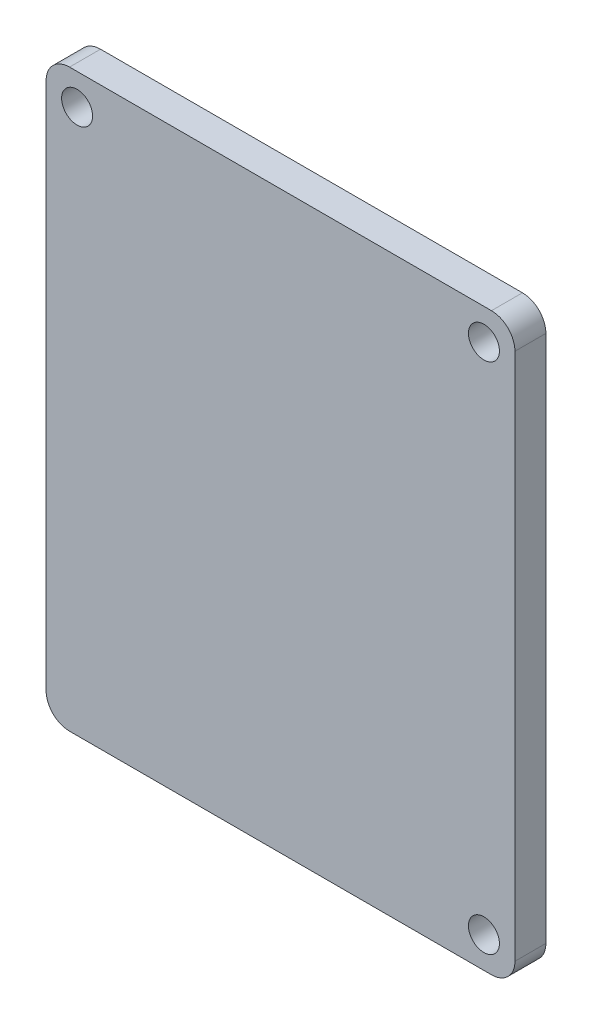
ISO-10303-21;
HEADER;
FILE_DESCRIPTION(('STEP AP214'),'2;1');
FILE_NAME('part.step','',(''),(''),'','','');
FILE_SCHEMA(('AUTOMOTIVE_DESIGN { 1 0 10303 214 1 1 1 1 }'));
ENDSEC;
DATA;
#1=APPLICATION_CONTEXT('core data for automotive mechanical design processes');
#2=APPLICATION_PROTOCOL_DEFINITION('international standard','automotive_design',2000,#1);
#3=PRODUCT_CONTEXT('',#1,'mechanical');
#4=PRODUCT('Part','Part','',(#3));
#5=PRODUCT_RELATED_PRODUCT_CATEGORY('part','',(#4));
#6=PRODUCT_DEFINITION_FORMATION('','',#4);
#7=PRODUCT_DEFINITION_CONTEXT('part definition',#1,'design');
#8=PRODUCT_DEFINITION('design','',#6,#7);
#9=PRODUCT_DEFINITION_SHAPE('','',#8);
#10=(LENGTH_UNIT() NAMED_UNIT(*) SI_UNIT(.MILLI.,.METRE.));
#11=(NAMED_UNIT(*) PLANE_ANGLE_UNIT() SI_UNIT($,.RADIAN.));
#12=(NAMED_UNIT(*) SI_UNIT($,.STERADIAN.) SOLID_ANGLE_UNIT());
#13=UNCERTAINTY_MEASURE_WITH_UNIT(LENGTH_MEASURE(1.E-05),#10,'distance_accuracy_value','');
#14=(GEOMETRIC_REPRESENTATION_CONTEXT(3) GLOBAL_UNCERTAINTY_ASSIGNED_CONTEXT((#13)) GLOBAL_UNIT_ASSIGNED_CONTEXT((#10,
#11,#12)) REPRESENTATION_CONTEXT('',''));
#15=CARTESIAN_POINT('',(0.,0.,0.));
#16=DIRECTION('',(0.,0.,1.));
#17=DIRECTION('',(1.,0.,0.));
#18=AXIS2_PLACEMENT_3D('',#15,#16,#17);
#19=CARTESIAN_POINT('',(2.2696921364756,53.4303078635244,3.));
#20=DIRECTION('',(0.,0.,1.));
#21=DIRECTION('',(1.,0.,0.));
#22=AXIS2_PLACEMENT_3D('',#19,#20,#21);
#23=PLANE('',#22);
#24=CARTESIAN_POINT('',(42.4,52.7,3.));
#25=DIRECTION('',(0.,0.,1.));
#26=DIRECTION('',(1.,0.,0.));
#27=AXIS2_PLACEMENT_3D('',#24,#25,#26);
#28=CIRCLE('',#27,1.5);
#29=CARTESIAN_POINT('',(43.9,52.7,3.));
#30=VERTEX_POINT('',#29);
#31=EDGE_CURVE('E188',#30,#30,#28,.T.);
#32=ORIENTED_EDGE('',*,*,#31,.F.);
#33=EDGE_LOOP('',(#32));
#34=FACE_BOUND('',#33,.T.);
#35=CARTESIAN_POINT('',(2.2696921364756,53.4303078635244,3.));
#36=DIRECTION('',(0.,0.,1.));
#37=DIRECTION('',(1.,0.,0.));
#38=AXIS2_PLACEMENT_3D('',#35,#36,#37);
#39=CIRCLE('',#38,2.26969213647562);
#40=CARTESIAN_POINT('',(2.26969213647562,55.7,3.));
#41=VERTEX_POINT('',#40);
#42=CARTESIAN_POINT('',(0.,53.4303078635244,3.));
#43=VERTEX_POINT('',#42);
#44=EDGE_CURVE('E151',#41,#43,#39,.T.);
#45=ORIENTED_EDGE('',*,*,#44,.T.);
#46=DIRECTION('',(0.,-1.,0.));
#47=VECTOR('',#46,1.);
#48=CARTESIAN_POINT('',(0.,2.26969213647563,3.));
#49=LINE('',#48,#47);
#50=CARTESIAN_POINT('',(0.,2.26969213647562,3.));
#51=VERTEX_POINT('',#50);
#52=EDGE_CURVE('E99',#43,#51,#49,.T.);
#53=ORIENTED_EDGE('',*,*,#52,.T.);
#54=CARTESIAN_POINT('',(2.26969213647562,2.26969213647562,3.));
#55=DIRECTION('',(0.,0.,1.));
#56=DIRECTION('',(-1.,0.,0.));
#57=AXIS2_PLACEMENT_3D('',#54,#55,#56);
#58=CIRCLE('',#57,2.26969213647562);
#59=CARTESIAN_POINT('',(2.26969213647563,0.,3.));
#60=VERTEX_POINT('',#59);
#61=EDGE_CURVE('E166',#51,#60,#58,.T.);
#62=ORIENTED_EDGE('',*,*,#61,.T.);
#63=DIRECTION('',(1.,0.,0.));
#64=VECTOR('',#63,1.);
#65=CARTESIAN_POINT('',(2.26969213647563,0.,3.));
#66=LINE('',#65,#64);
#67=CARTESIAN_POINT('',(43.1303078635244,0.,3.));
#68=VERTEX_POINT('',#67);
#69=EDGE_CURVE('E179',#60,#68,#66,.T.);
#70=ORIENTED_EDGE('',*,*,#69,.T.);
#71=CARTESIAN_POINT('',(43.1303078635244,2.26969213647562,3.));
#72=DIRECTION('',(0.,0.,1.));
#73=DIRECTION('',(1.,0.,0.));
#74=AXIS2_PLACEMENT_3D('',#71,#72,#73);
#75=CIRCLE('',#74,2.26969213647562);
#76=CARTESIAN_POINT('',(45.4,2.26969213647563,3.));
#77=VERTEX_POINT('',#76);
#78=EDGE_CURVE('E118',#68,#77,#75,.T.);
#79=ORIENTED_EDGE('',*,*,#78,.T.);
#80=DIRECTION('',(0.,1.,0.));
#81=VECTOR('',#80,1.);
#82=CARTESIAN_POINT('',(45.4,2.26969213647563,3.));
#83=LINE('',#82,#81);
#84=CARTESIAN_POINT('',(45.4,53.4303078635244,3.));
#85=VERTEX_POINT('',#84);
#86=EDGE_CURVE('E112',#77,#85,#83,.T.);
#87=ORIENTED_EDGE('',*,*,#86,.T.);
#88=CARTESIAN_POINT('',(43.1303078635244,53.4303078635244,3.));
#89=DIRECTION('',(0.,0.,1.));
#90=DIRECTION('',(1.,0.,0.));
#91=AXIS2_PLACEMENT_3D('',#88,#89,#90);
#92=CIRCLE('',#91,2.26969213647562);
#93=CARTESIAN_POINT('',(43.1303078635244,55.7,3.));
#94=VERTEX_POINT('',#93);
#95=EDGE_CURVE('E116',#85,#94,#92,.T.);
#96=ORIENTED_EDGE('',*,*,#95,.T.);
#97=DIRECTION('',(-1.,0.,0.));
#98=VECTOR('',#97,1.);
#99=CARTESIAN_POINT('',(2.26969213647562,55.7,3.));
#100=LINE('',#99,#98);
#101=EDGE_CURVE('E56',#94,#41,#100,.T.);
#102=ORIENTED_EDGE('',*,*,#101,.T.);
#103=EDGE_LOOP('',(#45,#53,#62,#70,#79,#87,#96,#102));
#104=FACE_BOUND('',#103,.T.);
#105=CARTESIAN_POINT('',(42.4,3.,3.));
#106=DIRECTION('',(0.,0.,1.));
#107=DIRECTION('',(1.,0.,0.));
#108=AXIS2_PLACEMENT_3D('',#105,#106,#107);
#109=CIRCLE('',#108,1.5);
#110=CARTESIAN_POINT('',(43.9,3.,3.));
#111=VERTEX_POINT('',#110);
#112=EDGE_CURVE('E140',#111,#111,#109,.T.);
#113=ORIENTED_EDGE('',*,*,#112,.F.);
#114=EDGE_LOOP('',(#113));
#115=FACE_BOUND('',#114,.T.);
#116=CARTESIAN_POINT('',(3.,52.7,3.));
#117=DIRECTION('',(0.,0.,1.));
#118=DIRECTION('',(1.,0.,0.));
#119=AXIS2_PLACEMENT_3D('',#116,#117,#118);
#120=CIRCLE('',#119,1.5);
#121=CARTESIAN_POINT('',(4.5,52.7,3.));
#122=VERTEX_POINT('',#121);
#123=EDGE_CURVE('E194',#122,#122,#120,.T.);
#124=ORIENTED_EDGE('',*,*,#123,.F.);
#125=EDGE_LOOP('',(#124));
#126=FACE_BOUND('',#125,.T.);
#127=ADVANCED_FACE('F39',(#34,#104,#115,#126),#23,.T.);
#128=CARTESIAN_POINT('',(2.2696921364756,53.4303078635244,0.));
#129=DIRECTION('',(0.,0.,1.));
#130=DIRECTION('',(1.,0.,0.));
#131=AXIS2_PLACEMENT_3D('',#128,#129,#130);
#132=PLANE('',#131);
#133=CARTESIAN_POINT('',(2.2696921364756,53.4303078635244,0.));
#134=DIRECTION('',(0.,0.,1.));
#135=DIRECTION('',(1.,0.,0.));
#136=AXIS2_PLACEMENT_3D('',#133,#134,#135);
#137=CIRCLE('',#136,2.26969213647562);
#138=CARTESIAN_POINT('',(2.26969213647562,55.7,0.));
#139=VERTEX_POINT('',#138);
#140=CARTESIAN_POINT('',(0.,53.4303078635244,0.));
#141=VERTEX_POINT('',#140);
#142=EDGE_CURVE('E136',#139,#141,#137,.T.);
#143=ORIENTED_EDGE('',*,*,#142,.F.);
#144=DIRECTION('',(-1.,0.,0.));
#145=VECTOR('',#144,1.);
#146=CARTESIAN_POINT('',(2.26969213647562,55.7,0.));
#147=LINE('',#146,#145);
#148=CARTESIAN_POINT('',(43.1303078635244,55.7,0.));
#149=VERTEX_POINT('',#148);
#150=EDGE_CURVE('E91',#149,#139,#147,.T.);
#151=ORIENTED_EDGE('',*,*,#150,.F.);
#152=CARTESIAN_POINT('',(43.1303078635244,53.4303078635244,0.));
#153=DIRECTION('',(0.,0.,1.));
#154=DIRECTION('',(1.,0.,0.));
#155=AXIS2_PLACEMENT_3D('',#152,#153,#154);
#156=CIRCLE('',#155,2.26969213647562);
#157=CARTESIAN_POINT('',(45.4,53.4303078635244,0.));
#158=VERTEX_POINT('',#157);
#159=EDGE_CURVE('E85',#158,#149,#156,.T.);
#160=ORIENTED_EDGE('',*,*,#159,.F.);
#161=DIRECTION('',(0.,1.,0.));
#162=VECTOR('',#161,1.);
#163=CARTESIAN_POINT('',(45.4,2.26969213647563,0.));
#164=LINE('',#163,#162);
#165=CARTESIAN_POINT('',(45.4,2.26969213647563,0.));
#166=VERTEX_POINT('',#165);
#167=EDGE_CURVE('E126',#166,#158,#164,.T.);
#168=ORIENTED_EDGE('',*,*,#167,.F.);
#169=CARTESIAN_POINT('',(43.1303078635244,2.26969213647562,0.));
#170=DIRECTION('',(0.,0.,1.));
#171=DIRECTION('',(1.,0.,0.));
#172=AXIS2_PLACEMENT_3D('',#169,#170,#171);
#173=CIRCLE('',#172,2.26969213647562);
#174=CARTESIAN_POINT('',(43.1303078635244,0.,0.));
#175=VERTEX_POINT('',#174);
#176=EDGE_CURVE('E146',#175,#166,#173,.T.);
#177=ORIENTED_EDGE('',*,*,#176,.F.);
#178=DIRECTION('',(1.,0.,0.));
#179=VECTOR('',#178,1.);
#180=CARTESIAN_POINT('',(2.26969213647563,0.,0.));
#181=LINE('',#180,#179);
#182=CARTESIAN_POINT('',(2.26969213647563,0.,0.));
#183=VERTEX_POINT('',#182);
#184=EDGE_CURVE('E144',#183,#175,#181,.T.);
#185=ORIENTED_EDGE('',*,*,#184,.F.);
#186=CARTESIAN_POINT('',(2.26969213647562,2.26969213647562,0.));
#187=DIRECTION('',(0.,0.,1.));
#188=DIRECTION('',(-1.,0.,0.));
#189=AXIS2_PLACEMENT_3D('',#186,#187,#188);
#190=CIRCLE('',#189,2.26969213647562);
#191=CARTESIAN_POINT('',(0.,2.26969213647562,0.));
#192=VERTEX_POINT('',#191);
#193=EDGE_CURVE('E142',#192,#183,#190,.T.);
#194=ORIENTED_EDGE('',*,*,#193,.F.);
#195=DIRECTION('',(0.,-1.,0.));
#196=VECTOR('',#195,1.);
#197=CARTESIAN_POINT('',(0.,2.26969213647563,0.));
#198=LINE('',#197,#196);
#199=EDGE_CURVE('E139',#141,#192,#198,.T.);
#200=ORIENTED_EDGE('',*,*,#199,.F.);
#201=EDGE_LOOP('',(#143,#151,#160,#168,#177,#185,#194,#200));
#202=FACE_BOUND('',#201,.T.);
#203=CARTESIAN_POINT('',(42.4,3.,0.));
#204=DIRECTION('',(0.,0.,1.));
#205=DIRECTION('',(1.,0.,0.));
#206=AXIS2_PLACEMENT_3D('',#203,#204,#205);
#207=CIRCLE('',#206,1.5);
#208=CARTESIAN_POINT('',(43.9,3.,0.));
#209=VERTEX_POINT('',#208);
#210=EDGE_CURVE('E185',#209,#209,#207,.T.);
#211=ORIENTED_EDGE('',*,*,#210,.T.);
#212=EDGE_LOOP('',(#211));
#213=FACE_BOUND('',#212,.T.);
#214=CARTESIAN_POINT('',(42.4,52.7,0.));
#215=DIRECTION('',(0.,0.,1.));
#216=DIRECTION('',(1.,0.,0.));
#217=AXIS2_PLACEMENT_3D('',#214,#215,#216);
#218=CIRCLE('',#217,1.5);
#219=CARTESIAN_POINT('',(43.9,52.7,0.));
#220=VERTEX_POINT('',#219);
#221=EDGE_CURVE('E191',#220,#220,#218,.T.);
#222=ORIENTED_EDGE('',*,*,#221,.T.);
#223=EDGE_LOOP('',(#222));
#224=FACE_BOUND('',#223,.T.);
#225=CARTESIAN_POINT('',(3.,52.7,0.));
#226=DIRECTION('',(0.,0.,1.));
#227=DIRECTION('',(1.,0.,0.));
#228=AXIS2_PLACEMENT_3D('',#225,#226,#227);
#229=CIRCLE('',#228,1.5);
#230=CARTESIAN_POINT('',(4.5,52.7,0.));
#231=VERTEX_POINT('',#230);
#232=EDGE_CURVE('E197',#231,#231,#229,.T.);
#233=ORIENTED_EDGE('',*,*,#232,.T.);
#234=EDGE_LOOP('',(#233));
#235=FACE_BOUND('',#234,.T.);
#236=ADVANCED_FACE('F170',(#202,#213,#224,#235),#132,.F.);
#237=CARTESIAN_POINT('',(2.2696921364756,53.4303078635244,3.));
#238=DIRECTION('',(0.,0.,-1.));
#239=DIRECTION('',(-1.,0.,0.));
#240=AXIS2_PLACEMENT_3D('',#237,#238,#239);
#241=CYLINDRICAL_SURFACE('',#240,2.26969213647562);
#242=ORIENTED_EDGE('',*,*,#142,.T.);
#243=DIRECTION('',(0.,0.,-1.));
#244=VECTOR('',#243,1.);
#245=CARTESIAN_POINT('',(0.,53.4303078635244,3.));
#246=LINE('',#245,#244);
#247=EDGE_CURVE('E11',#43,#141,#246,.T.);
#248=ORIENTED_EDGE('',*,*,#247,.F.);
#249=ORIENTED_EDGE('',*,*,#44,.F.);
#250=DIRECTION('',(0.,0.,-1.));
#251=VECTOR('',#250,1.);
#252=CARTESIAN_POINT('',(2.26969213647562,55.7,3.));
#253=LINE('',#252,#251);
#254=EDGE_CURVE('E132',#41,#139,#253,.T.);
#255=ORIENTED_EDGE('',*,*,#254,.T.);
#256=EDGE_LOOP('',(#242,#248,#249,#255));
#257=FACE_BOUND('',#256,.T.);
#258=ADVANCED_FACE('F41',(#257),#241,.T.);
#259=CARTESIAN_POINT('',(0.,2.26969213647563,3.));
#260=DIRECTION('',(1.,0.,0.));
#261=DIRECTION('',(0.,1.,0.));
#262=AXIS2_PLACEMENT_3D('',#259,#260,#261);
#263=PLANE('',#262);
#264=ORIENTED_EDGE('',*,*,#199,.T.);
#265=DIRECTION('',(0.,0.,-1.));
#266=VECTOR('',#265,1.);
#267=CARTESIAN_POINT('',(0.,2.26969213647562,3.));
#268=LINE('',#267,#266);
#269=EDGE_CURVE('E48',#51,#192,#268,.T.);
#270=ORIENTED_EDGE('',*,*,#269,.F.);
#271=ORIENTED_EDGE('',*,*,#52,.F.);
#272=ORIENTED_EDGE('',*,*,#247,.T.);
#273=EDGE_LOOP('',(#264,#270,#271,#272));
#274=FACE_BOUND('',#273,.T.);
#275=ADVANCED_FACE('F230',(#274),#263,.F.);
#276=CARTESIAN_POINT('',(2.26969213647562,2.26969213647562,3.));
#277=DIRECTION('',(0.,0.,-1.));
#278=DIRECTION('',(-1.,0.,0.));
#279=AXIS2_PLACEMENT_3D('',#276,#277,#278);
#280=CYLINDRICAL_SURFACE('',#279,2.26969213647562);
#281=ORIENTED_EDGE('',*,*,#193,.T.);
#282=DIRECTION('',(0.,0.,-1.));
#283=VECTOR('',#282,1.);
#284=CARTESIAN_POINT('',(2.26969213647563,0.,3.));
#285=LINE('',#284,#283);
#286=EDGE_CURVE('E158',#60,#183,#285,.T.);
#287=ORIENTED_EDGE('',*,*,#286,.F.);
#288=ORIENTED_EDGE('',*,*,#61,.F.);
#289=ORIENTED_EDGE('',*,*,#269,.T.);
#290=EDGE_LOOP('',(#281,#287,#288,#289));
#291=FACE_BOUND('',#290,.T.);
#292=ADVANCED_FACE('F164',(#291),#280,.T.);
#293=CARTESIAN_POINT('',(2.26969213647563,0.,3.));
#294=DIRECTION('',(0.,1.,0.));
#295=DIRECTION('',(0.,0.,1.));
#296=AXIS2_PLACEMENT_3D('',#293,#294,#295);
#297=PLANE('',#296);
#298=ORIENTED_EDGE('',*,*,#184,.T.);
#299=DIRECTION('',(0.,0.,-1.));
#300=VECTOR('',#299,1.);
#301=CARTESIAN_POINT('',(43.1303078635244,0.,3.));
#302=LINE('',#301,#300);
#303=EDGE_CURVE('E155',#68,#175,#302,.T.);
#304=ORIENTED_EDGE('',*,*,#303,.F.);
#305=ORIENTED_EDGE('',*,*,#69,.F.);
#306=ORIENTED_EDGE('',*,*,#286,.T.);
#307=EDGE_LOOP('',(#298,#304,#305,#306));
#308=FACE_BOUND('',#307,.T.);
#309=ADVANCED_FACE('F175',(#308),#297,.F.);
#310=CARTESIAN_POINT('',(43.1303078635244,2.26969213647562,3.));
#311=DIRECTION('',(0.,0.,-1.));
#312=DIRECTION('',(-1.,0.,0.));
#313=AXIS2_PLACEMENT_3D('',#310,#311,#312);
#314=CYLINDRICAL_SURFACE('',#313,2.26969213647562);
#315=ORIENTED_EDGE('',*,*,#176,.T.);
#316=DIRECTION('',(0.,0.,-1.));
#317=VECTOR('',#316,1.);
#318=CARTESIAN_POINT('',(45.4,2.26969213647563,3.));
#319=LINE('',#318,#317);
#320=EDGE_CURVE('E127',#77,#166,#319,.T.);
#321=ORIENTED_EDGE('',*,*,#320,.F.);
#322=ORIENTED_EDGE('',*,*,#78,.F.);
#323=ORIENTED_EDGE('',*,*,#303,.T.);
#324=EDGE_LOOP('',(#315,#321,#322,#323));
#325=FACE_BOUND('',#324,.T.);
#326=ADVANCED_FACE('F178',(#325),#314,.T.);
#327=CARTESIAN_POINT('',(45.4,2.26969213647563,3.));
#328=DIRECTION('',(-1.,0.,0.));
#329=DIRECTION('',(0.,-1.,0.));
#330=AXIS2_PLACEMENT_3D('',#327,#328,#329);
#331=PLANE('',#330);
#332=ORIENTED_EDGE('',*,*,#167,.T.);
#333=DIRECTION('',(0.,0.,-1.));
#334=VECTOR('',#333,1.);
#335=CARTESIAN_POINT('',(45.4,53.4303078635244,3.));
#336=LINE('',#335,#334);
#337=EDGE_CURVE('E123',#85,#158,#336,.T.);
#338=ORIENTED_EDGE('',*,*,#337,.F.);
#339=ORIENTED_EDGE('',*,*,#86,.F.);
#340=ORIENTED_EDGE('',*,*,#320,.T.);
#341=EDGE_LOOP('',(#332,#338,#339,#340));
#342=FACE_BOUND('',#341,.T.);
#343=ADVANCED_FACE('F124',(#342),#331,.F.);
#344=CARTESIAN_POINT('',(43.1303078635244,53.4303078635244,3.));
#345=DIRECTION('',(0.,0.,-1.));
#346=DIRECTION('',(-1.,0.,0.));
#347=AXIS2_PLACEMENT_3D('',#344,#345,#346);
#348=CYLINDRICAL_SURFACE('',#347,2.26969213647562);
#349=ORIENTED_EDGE('',*,*,#159,.T.);
#350=DIRECTION('',(0.,0.,-1.));
#351=VECTOR('',#350,1.);
#352=CARTESIAN_POINT('',(43.1303078635244,55.7,3.));
#353=LINE('',#352,#351);
#354=EDGE_CURVE('E128',#94,#149,#353,.T.);
#355=ORIENTED_EDGE('',*,*,#354,.F.);
#356=ORIENTED_EDGE('',*,*,#95,.F.);
#357=ORIENTED_EDGE('',*,*,#337,.T.);
#358=EDGE_LOOP('',(#349,#355,#356,#357));
#359=FACE_BOUND('',#358,.T.);
#360=ADVANCED_FACE('F130',(#359),#348,.T.);
#361=CARTESIAN_POINT('',(2.26969213647562,55.7,3.));
#362=DIRECTION('',(0.,-1.,0.));
#363=DIRECTION('',(0.,0.,-1.));
#364=AXIS2_PLACEMENT_3D('',#361,#362,#363);
#365=PLANE('',#364);
#366=ORIENTED_EDGE('',*,*,#150,.T.);
#367=ORIENTED_EDGE('',*,*,#254,.F.);
#368=ORIENTED_EDGE('',*,*,#101,.F.);
#369=ORIENTED_EDGE('',*,*,#354,.T.);
#370=EDGE_LOOP('',(#366,#367,#368,#369));
#371=FACE_BOUND('',#370,.T.);
#372=ADVANCED_FACE('F218',(#371),#365,.F.);
#373=CARTESIAN_POINT('',(42.4,3.,3.));
#374=DIRECTION('',(0.,0.,-1.));
#375=DIRECTION('',(-1.,0.,0.));
#376=AXIS2_PLACEMENT_3D('',#373,#374,#375);
#377=CYLINDRICAL_SURFACE('',#376,1.5);
#378=ORIENTED_EDGE('',*,*,#112,.T.);
#379=EDGE_LOOP('',(#378));
#380=FACE_BOUND('',#379,.T.);
#381=ORIENTED_EDGE('',*,*,#210,.F.);
#382=EDGE_LOOP('',(#381));
#383=FACE_BOUND('',#382,.T.);
#384=ADVANCED_FACE('F215',(#380,#383),#377,.F.);
#385=CARTESIAN_POINT('',(42.4,52.7,3.));
#386=DIRECTION('',(0.,0.,-1.));
#387=DIRECTION('',(-1.,0.,0.));
#388=AXIS2_PLACEMENT_3D('',#385,#386,#387);
#389=CYLINDRICAL_SURFACE('',#388,1.5);
#390=ORIENTED_EDGE('',*,*,#31,.T.);
#391=EDGE_LOOP('',(#390));
#392=FACE_BOUND('',#391,.T.);
#393=ORIENTED_EDGE('',*,*,#221,.F.);
#394=EDGE_LOOP('',(#393));
#395=FACE_BOUND('',#394,.T.);
#396=ADVANCED_FACE('F293',(#392,#395),#389,.F.);
#397=CARTESIAN_POINT('',(3.,52.7,3.));
#398=DIRECTION('',(0.,0.,-1.));
#399=DIRECTION('',(-1.,0.,0.));
#400=AXIS2_PLACEMENT_3D('',#397,#398,#399);
#401=CYLINDRICAL_SURFACE('',#400,1.5);
#402=ORIENTED_EDGE('',*,*,#123,.T.);
#403=EDGE_LOOP('',(#402));
#404=FACE_BOUND('',#403,.T.);
#405=ORIENTED_EDGE('',*,*,#232,.F.);
#406=EDGE_LOOP('',(#405));
#407=FACE_BOUND('',#406,.T.);
#408=ADVANCED_FACE('F203',(#404,#407),#401,.F.);
#409=CLOSED_SHELL('',(#127,#236,#258,#275,#292,#309,#326,#343,#360,#372,#384,#396,#408));
#410=MANIFOLD_SOLID_BREP('B2',#409);
#411=ADVANCED_BREP_SHAPE_REPRESENTATION('',(#18,#410),#14);
#412=SHAPE_DEFINITION_REPRESENTATION(#9,#411);
ENDSEC;
END-ISO-10303-21;
